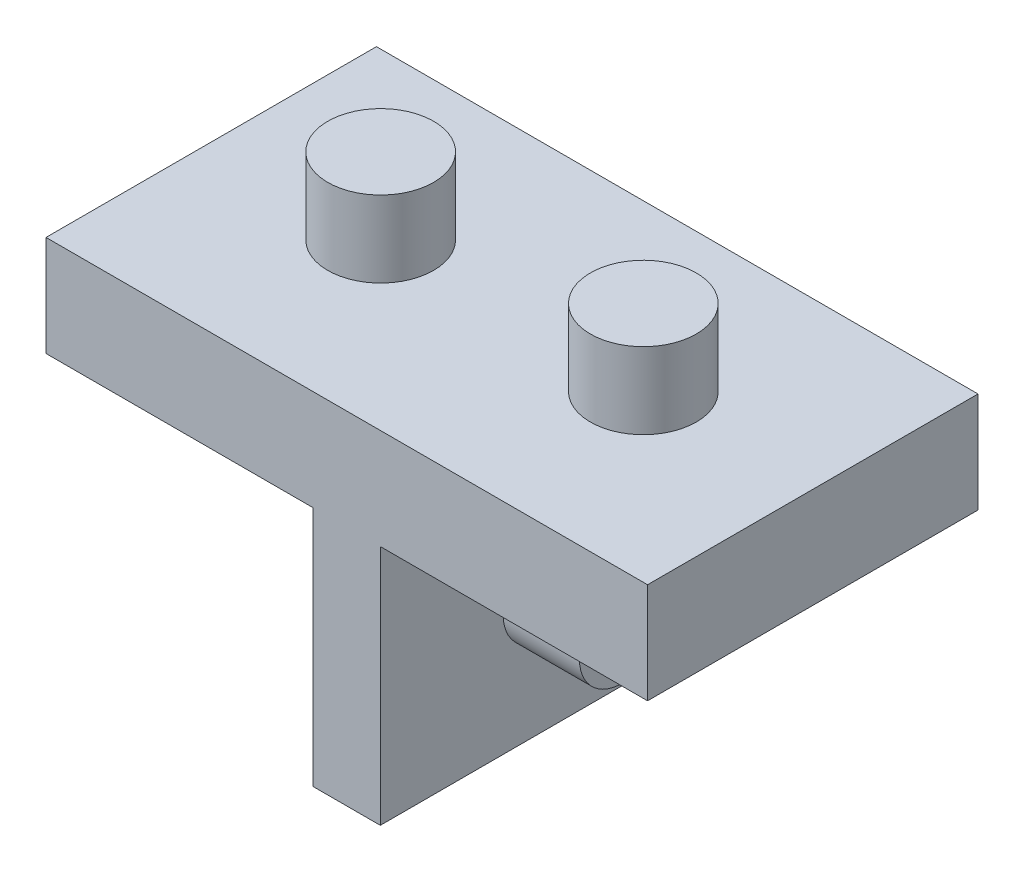
ISO-10303-21;
HEADER;
FILE_DESCRIPTION(('STEP AP214'),'2;1');
FILE_NAME('part.step','',(''),(''),'','','');
FILE_SCHEMA(('AUTOMOTIVE_DESIGN { 1 0 10303 214 1 1 1 1 }'));
ENDSEC;
DATA;
#1=APPLICATION_CONTEXT('core data for automotive mechanical design processes');
#2=APPLICATION_PROTOCOL_DEFINITION('international standard','automotive_design',2000,#1);
#3=PRODUCT_CONTEXT('',#1,'mechanical');
#4=PRODUCT('Part','Part','',(#3));
#5=PRODUCT_RELATED_PRODUCT_CATEGORY('part','',(#4));
#6=PRODUCT_DEFINITION_FORMATION('','',#4);
#7=PRODUCT_DEFINITION_CONTEXT('part definition',#1,'design');
#8=PRODUCT_DEFINITION('design','',#6,#7);
#9=PRODUCT_DEFINITION_SHAPE('','',#8);
#10=(LENGTH_UNIT() NAMED_UNIT(*) SI_UNIT(.MILLI.,.METRE.));
#11=(NAMED_UNIT(*) PLANE_ANGLE_UNIT() SI_UNIT($,.RADIAN.));
#12=(NAMED_UNIT(*) SI_UNIT($,.STERADIAN.) SOLID_ANGLE_UNIT());
#13=UNCERTAINTY_MEASURE_WITH_UNIT(LENGTH_MEASURE(1.E-05),#10,'distance_accuracy_value','');
#14=(GEOMETRIC_REPRESENTATION_CONTEXT(3) GLOBAL_UNCERTAINTY_ASSIGNED_CONTEXT((#13)) GLOBAL_UNIT_ASSIGNED_CONTEXT((#10,
#11,#12)) REPRESENTATION_CONTEXT('',''));
#15=CARTESIAN_POINT('',(0.,0.,0.));
#16=DIRECTION('',(0.,0.,1.));
#17=DIRECTION('',(1.,0.,0.));
#18=AXIS2_PLACEMENT_3D('',#15,#16,#17);
#19=CARTESIAN_POINT('',(21.3,7.12,11.7));
#20=DIRECTION('',(0.,-1.,0.));
#21=DIRECTION('',(1.,0.,0.));
#22=AXIS2_PLACEMENT_3D('',#19,#20,#21);
#23=PLANE('',#22);
#24=CARTESIAN_POINT('',(-9.3,7.12,0.));
#25=DIRECTION('',(0.,-1.,0.));
#26=DIRECTION('',(1.,0.,0.));
#27=AXIS2_PLACEMENT_3D('',#24,#25,#26);
#28=CIRCLE('',#27,3.75);
#29=CARTESIAN_POINT('',(-5.55,7.12,0.));
#30=VERTEX_POINT('',#29);
#31=EDGE_CURVE('E53',#30,#30,#28,.F.);
#32=ORIENTED_EDGE('',*,*,#31,.F.);
#33=EDGE_LOOP('',(#32));
#34=FACE_BOUND('',#33,.T.);
#35=CARTESIAN_POINT('',(9.3,7.12,0.));
#36=DIRECTION('',(0.,-1.,0.));
#37=DIRECTION('',(1.,0.,0.));
#38=AXIS2_PLACEMENT_3D('',#35,#36,#37);
#39=CIRCLE('',#38,3.75);
#40=CARTESIAN_POINT('',(13.05,7.12,0.));
#41=VERTEX_POINT('',#40);
#42=EDGE_CURVE('E191',#41,#41,#39,.F.);
#43=ORIENTED_EDGE('',*,*,#42,.F.);
#44=EDGE_LOOP('',(#43));
#45=FACE_BOUND('',#44,.T.);
#46=DIRECTION('',(-1.,0.,0.));
#47=VECTOR('',#46,1.);
#48=CARTESIAN_POINT('',(21.3,7.12,-11.7));
#49=LINE('',#48,#47);
#50=CARTESIAN_POINT('',(21.3,7.12,-11.7));
#51=VERTEX_POINT('',#50);
#52=CARTESIAN_POINT('',(-21.3,7.12,-11.7));
#53=VERTEX_POINT('',#52);
#54=EDGE_CURVE('E146',#51,#53,#49,.T.);
#55=ORIENTED_EDGE('',*,*,#54,.T.);
#56=DIRECTION('',(0.,0.,-1.));
#57=VECTOR('',#56,1.);
#58=CARTESIAN_POINT('',(-21.3,7.12,11.7));
#59=LINE('',#58,#57);
#60=CARTESIAN_POINT('',(-21.3,7.12,11.7));
#61=VERTEX_POINT('',#60);
#62=EDGE_CURVE('E188',#61,#53,#59,.T.);
#63=ORIENTED_EDGE('',*,*,#62,.F.);
#64=DIRECTION('',(-1.,0.,0.));
#65=VECTOR('',#64,1.);
#66=CARTESIAN_POINT('',(21.3,7.12,11.7));
#67=LINE('',#66,#65);
#68=CARTESIAN_POINT('',(21.3,7.12,11.7));
#69=VERTEX_POINT('',#68);
#70=EDGE_CURVE('E169',#69,#61,#67,.T.);
#71=ORIENTED_EDGE('',*,*,#70,.F.);
#72=DIRECTION('',(0.,0.,-1.));
#73=VECTOR('',#72,1.);
#74=CARTESIAN_POINT('',(21.3,7.12,11.7));
#75=LINE('',#74,#73);
#76=EDGE_CURVE('E142',#69,#51,#75,.T.);
#77=ORIENTED_EDGE('',*,*,#76,.T.);
#78=EDGE_LOOP('',(#55,#63,#71,#77));
#79=FACE_BOUND('',#78,.T.);
#80=ADVANCED_FACE('F44',(#34,#45,#79),#23,.F.);
#81=CARTESIAN_POINT('',(-21.3,7.12,11.7));
#82=DIRECTION('',(1.,0.,0.));
#83=DIRECTION('',(0.,0.,-1.));
#84=AXIS2_PLACEMENT_3D('',#81,#82,#83);
#85=PLANE('',#84);
#86=DIRECTION('',(0.,-1.,0.));
#87=VECTOR('',#86,1.);
#88=CARTESIAN_POINT('',(-21.3,7.12,-11.7));
#89=LINE('',#88,#87);
#90=CARTESIAN_POINT('',(-21.3,0.,-11.7));
#91=VERTEX_POINT('',#90);
#92=EDGE_CURVE('E150',#53,#91,#89,.T.);
#93=ORIENTED_EDGE('',*,*,#92,.T.);
#94=DIRECTION('',(0.,0.,-1.));
#95=VECTOR('',#94,1.);
#96=CARTESIAN_POINT('',(-21.3,0.,11.7));
#97=LINE('',#96,#95);
#98=CARTESIAN_POINT('',(-21.3,0.,11.7));
#99=VERTEX_POINT('',#98);
#100=EDGE_CURVE('E184',#99,#91,#97,.T.);
#101=ORIENTED_EDGE('',*,*,#100,.F.);
#102=DIRECTION('',(0.,-1.,0.));
#103=VECTOR('',#102,1.);
#104=CARTESIAN_POINT('',(-21.3,7.12,11.7));
#105=LINE('',#104,#103);
#106=EDGE_CURVE('E105',#61,#99,#105,.T.);
#107=ORIENTED_EDGE('',*,*,#106,.F.);
#108=ORIENTED_EDGE('',*,*,#62,.T.);
#109=EDGE_LOOP('',(#93,#101,#107,#108));
#110=FACE_BOUND('',#109,.T.);
#111=ADVANCED_FACE('F202',(#110),#85,.F.);
#112=CARTESIAN_POINT('',(-21.3,0.,11.7));
#113=DIRECTION('',(0.,1.,0.));
#114=DIRECTION('',(0.,0.,1.));
#115=AXIS2_PLACEMENT_3D('',#112,#113,#114);
#116=PLANE('',#115);
#117=DIRECTION('',(1.,0.,0.));
#118=VECTOR('',#117,1.);
#119=CARTESIAN_POINT('',(-21.3,0.,-11.7));
#120=LINE('',#119,#118);
#121=CARTESIAN_POINT('',(-2.375,0.,-11.7));
#122=VERTEX_POINT('',#121);
#123=EDGE_CURVE('E154',#91,#122,#120,.T.);
#124=ORIENTED_EDGE('',*,*,#123,.T.);
#125=DIRECTION('',(0.,0.,-1.));
#126=VECTOR('',#125,1.);
#127=CARTESIAN_POINT('',(-2.375,0.,11.7));
#128=LINE('',#127,#126);
#129=CARTESIAN_POINT('',(-2.375,0.,11.7));
#130=VERTEX_POINT('',#129);
#131=EDGE_CURVE('E180',#130,#122,#128,.T.);
#132=ORIENTED_EDGE('',*,*,#131,.F.);
#133=DIRECTION('',(1.,0.,0.));
#134=VECTOR('',#133,1.);
#135=CARTESIAN_POINT('',(-21.3,0.,11.7));
#136=LINE('',#135,#134);
#137=EDGE_CURVE('E297',#99,#130,#136,.T.);
#138=ORIENTED_EDGE('',*,*,#137,.F.);
#139=ORIENTED_EDGE('',*,*,#100,.T.);
#140=EDGE_LOOP('',(#124,#132,#138,#139));
#141=FACE_BOUND('',#140,.T.);
#142=ADVANCED_FACE('F213',(#141),#116,.F.);
#143=CARTESIAN_POINT('',(-2.375,0.,11.7));
#144=DIRECTION('',(1.,0.,0.));
#145=DIRECTION('',(0.,1.,0.));
#146=AXIS2_PLACEMENT_3D('',#143,#144,#145);
#147=PLANE('',#146);
#148=CARTESIAN_POINT('',(-2.375,-8.55,0.));
#149=DIRECTION('',(1.,0.,0.));
#150=DIRECTION('',(0.,0.,-1.));
#151=AXIS2_PLACEMENT_3D('',#148,#149,#150);
#152=CIRCLE('',#151,3.);
#153=CARTESIAN_POINT('',(-2.375,-8.55,-3.));
#154=VERTEX_POINT('',#153);
#155=EDGE_CURVE('E277',#154,#154,#152,.T.);
#156=ORIENTED_EDGE('',*,*,#155,.T.);
#157=EDGE_LOOP('',(#156));
#158=FACE_BOUND('',#157,.T.);
#159=DIRECTION('',(0.,-1.,0.));
#160=VECTOR('',#159,1.);
#161=CARTESIAN_POINT('',(-2.375,0.,-11.7));
#162=LINE('',#161,#160);
#163=CARTESIAN_POINT('',(-2.375,-17.1,-11.7));
#164=VERTEX_POINT('',#163);
#165=EDGE_CURVE('E157',#122,#164,#162,.T.);
#166=ORIENTED_EDGE('',*,*,#165,.T.);
#167=DIRECTION('',(0.,0.,-1.));
#168=VECTOR('',#167,1.);
#169=CARTESIAN_POINT('',(-2.375,-17.1,11.7));
#170=LINE('',#169,#168);
#171=CARTESIAN_POINT('',(-2.375,-17.1,11.7));
#172=VERTEX_POINT('',#171);
#173=EDGE_CURVE('E176',#172,#164,#170,.T.);
#174=ORIENTED_EDGE('',*,*,#173,.F.);
#175=DIRECTION('',(0.,-1.,0.));
#176=VECTOR('',#175,1.);
#177=CARTESIAN_POINT('',(-2.375,0.,11.7));
#178=LINE('',#177,#176);
#179=EDGE_CURVE('E300',#130,#172,#178,.T.);
#180=ORIENTED_EDGE('',*,*,#179,.F.);
#181=ORIENTED_EDGE('',*,*,#131,.T.);
#182=EDGE_LOOP('',(#166,#174,#180,#181));
#183=FACE_BOUND('',#182,.T.);
#184=ADVANCED_FACE('F217',(#158,#183),#147,.F.);
#185=CARTESIAN_POINT('',(-2.375,-17.1,11.7));
#186=DIRECTION('',(0.,1.,0.));
#187=DIRECTION('',(0.,0.,1.));
#188=AXIS2_PLACEMENT_3D('',#185,#186,#187);
#189=PLANE('',#188);
#190=DIRECTION('',(1.,0.,0.));
#191=VECTOR('',#190,1.);
#192=CARTESIAN_POINT('',(-2.375,-17.1,-11.7));
#193=LINE('',#192,#191);
#194=CARTESIAN_POINT('',(2.375,-17.1,-11.7));
#195=VERTEX_POINT('',#194);
#196=EDGE_CURVE('E160',#164,#195,#193,.T.);
#197=ORIENTED_EDGE('',*,*,#196,.T.);
#198=DIRECTION('',(0.,0.,-1.));
#199=VECTOR('',#198,1.);
#200=CARTESIAN_POINT('',(2.375,-17.1,11.7));
#201=LINE('',#200,#199);
#202=CARTESIAN_POINT('',(2.375,-17.1,11.7));
#203=VERTEX_POINT('',#202);
#204=EDGE_CURVE('E135',#203,#195,#201,.T.);
#205=ORIENTED_EDGE('',*,*,#204,.F.);
#206=DIRECTION('',(1.,0.,0.));
#207=VECTOR('',#206,1.);
#208=CARTESIAN_POINT('',(-2.375,-17.1,11.7));
#209=LINE('',#208,#207);
#210=EDGE_CURVE('E124',#172,#203,#209,.T.);
#211=ORIENTED_EDGE('',*,*,#210,.F.);
#212=ORIENTED_EDGE('',*,*,#173,.T.);
#213=EDGE_LOOP('',(#197,#205,#211,#212));
#214=FACE_BOUND('',#213,.T.);
#215=ADVANCED_FACE('F223',(#214),#189,.F.);
#216=CARTESIAN_POINT('',(2.375,-17.1,11.7));
#217=DIRECTION('',(-1.,0.,0.));
#218=DIRECTION('',(0.,-1.,0.));
#219=AXIS2_PLACEMENT_3D('',#216,#217,#218);
#220=PLANE('',#219);
#221=CARTESIAN_POINT('',(2.375,-8.55,0.));
#222=DIRECTION('',(-1.,0.,0.));
#223=DIRECTION('',(0.,-1.,0.));
#224=AXIS2_PLACEMENT_3D('',#221,#222,#223);
#225=CIRCLE('',#224,3.);
#226=CARTESIAN_POINT('',(2.375,-8.55,3.));
#227=VERTEX_POINT('',#226);
#228=EDGE_CURVE('E11',#227,#227,#225,.F.);
#229=ORIENTED_EDGE('',*,*,#228,.F.);
#230=EDGE_LOOP('',(#229));
#231=FACE_BOUND('',#230,.T.);
#232=DIRECTION('',(0.,1.,0.));
#233=VECTOR('',#232,1.);
#234=CARTESIAN_POINT('',(2.375,-17.1,-11.7));
#235=LINE('',#234,#233);
#236=CARTESIAN_POINT('',(2.375,0.,-11.7));
#237=VERTEX_POINT('',#236);
#238=EDGE_CURVE('E133',#195,#237,#235,.T.);
#239=ORIENTED_EDGE('',*,*,#238,.T.);
#240=DIRECTION('',(0.,0.,-1.));
#241=VECTOR('',#240,1.);
#242=CARTESIAN_POINT('',(2.375,0.,11.7));
#243=LINE('',#242,#241);
#244=CARTESIAN_POINT('',(2.375,0.,11.7));
#245=VERTEX_POINT('',#244);
#246=EDGE_CURVE('E130',#245,#237,#243,.T.);
#247=ORIENTED_EDGE('',*,*,#246,.F.);
#248=DIRECTION('',(0.,1.,0.));
#249=VECTOR('',#248,1.);
#250=CARTESIAN_POINT('',(2.375,-17.1,11.7));
#251=LINE('',#250,#249);
#252=EDGE_CURVE('E118',#203,#245,#251,.T.);
#253=ORIENTED_EDGE('',*,*,#252,.F.);
#254=ORIENTED_EDGE('',*,*,#204,.T.);
#255=EDGE_LOOP('',(#239,#247,#253,#254));
#256=FACE_BOUND('',#255,.T.);
#257=ADVANCED_FACE('F131',(#231,#256),#220,.F.);
#258=CARTESIAN_POINT('',(2.375,0.,11.7));
#259=DIRECTION('',(0.,1.,0.));
#260=DIRECTION('',(-1.,0.,0.));
#261=AXIS2_PLACEMENT_3D('',#258,#259,#260);
#262=PLANE('',#261);
#263=DIRECTION('',(1.,0.,0.));
#264=VECTOR('',#263,1.);
#265=CARTESIAN_POINT('',(2.375,0.,-11.7));
#266=LINE('',#265,#264);
#267=CARTESIAN_POINT('',(21.3,0.,-11.7));
#268=VERTEX_POINT('',#267);
#269=EDGE_CURVE('E90',#237,#268,#266,.T.);
#270=ORIENTED_EDGE('',*,*,#269,.T.);
#271=DIRECTION('',(0.,0.,-1.));
#272=VECTOR('',#271,1.);
#273=CARTESIAN_POINT('',(21.3,0.,11.7));
#274=LINE('',#273,#272);
#275=CARTESIAN_POINT('',(21.3,0.,11.7));
#276=VERTEX_POINT('',#275);
#277=EDGE_CURVE('E136',#276,#268,#274,.T.);
#278=ORIENTED_EDGE('',*,*,#277,.F.);
#279=DIRECTION('',(1.,0.,0.));
#280=VECTOR('',#279,1.);
#281=CARTESIAN_POINT('',(2.375,0.,11.7));
#282=LINE('',#281,#280);
#283=EDGE_CURVE('E122',#245,#276,#282,.T.);
#284=ORIENTED_EDGE('',*,*,#283,.F.);
#285=ORIENTED_EDGE('',*,*,#246,.T.);
#286=EDGE_LOOP('',(#270,#278,#284,#285));
#287=FACE_BOUND('',#286,.T.);
#288=ADVANCED_FACE('F138',(#287),#262,.F.);
#289=CARTESIAN_POINT('',(21.3,0.,11.7));
#290=DIRECTION('',(-1.,0.,0.));
#291=DIRECTION('',(0.,0.,1.));
#292=AXIS2_PLACEMENT_3D('',#289,#290,#291);
#293=PLANE('',#292);
#294=DIRECTION('',(0.,1.,0.));
#295=VECTOR('',#294,1.);
#296=CARTESIAN_POINT('',(21.3,0.,-11.7));
#297=LINE('',#296,#295);
#298=EDGE_CURVE('E96',#268,#51,#297,.T.);
#299=ORIENTED_EDGE('',*,*,#298,.T.);
#300=ORIENTED_EDGE('',*,*,#76,.F.);
#301=DIRECTION('',(0.,1.,0.));
#302=VECTOR('',#301,1.);
#303=CARTESIAN_POINT('',(21.3,0.,11.7));
#304=LINE('',#303,#302);
#305=EDGE_CURVE('E61',#276,#69,#304,.T.);
#306=ORIENTED_EDGE('',*,*,#305,.F.);
#307=ORIENTED_EDGE('',*,*,#277,.T.);
#308=EDGE_LOOP('',(#299,#300,#306,#307));
#309=FACE_BOUND('',#308,.T.);
#310=ADVANCED_FACE('F233',(#309),#293,.F.);
#311=CARTESIAN_POINT('',(0.,0.,11.7));
#312=DIRECTION('',(0.,0.,1.));
#313=DIRECTION('',(1.,0.,0.));
#314=AXIS2_PLACEMENT_3D('',#311,#312,#313);
#315=PLANE('',#314);
#316=ORIENTED_EDGE('',*,*,#70,.T.);
#317=ORIENTED_EDGE('',*,*,#106,.T.);
#318=ORIENTED_EDGE('',*,*,#137,.T.);
#319=ORIENTED_EDGE('',*,*,#179,.T.);
#320=ORIENTED_EDGE('',*,*,#210,.T.);
#321=ORIENTED_EDGE('',*,*,#252,.T.);
#322=ORIENTED_EDGE('',*,*,#283,.T.);
#323=ORIENTED_EDGE('',*,*,#305,.T.);
#324=EDGE_LOOP('',(#316,#317,#318,#319,#320,#321,#322,#323));
#325=FACE_BOUND('',#324,.T.);
#326=ADVANCED_FACE('F120',(#325),#315,.T.);
#327=CARTESIAN_POINT('',(0.,0.,-11.7));
#328=DIRECTION('',(0.,0.,1.));
#329=DIRECTION('',(1.,0.,0.));
#330=AXIS2_PLACEMENT_3D('',#327,#328,#329);
#331=PLANE('',#330);
#332=ORIENTED_EDGE('',*,*,#54,.F.);
#333=ORIENTED_EDGE('',*,*,#298,.F.);
#334=ORIENTED_EDGE('',*,*,#269,.F.);
#335=ORIENTED_EDGE('',*,*,#238,.F.);
#336=ORIENTED_EDGE('',*,*,#196,.F.);
#337=ORIENTED_EDGE('',*,*,#165,.F.);
#338=ORIENTED_EDGE('',*,*,#123,.F.);
#339=ORIENTED_EDGE('',*,*,#92,.F.);
#340=EDGE_LOOP('',(#332,#333,#334,#335,#336,#337,#338,#339));
#341=FACE_BOUND('',#340,.T.);
#342=ADVANCED_FACE('F209',(#341),#331,.F.);
#343=CARTESIAN_POINT('',(9.3,12.52,0.));
#344=DIRECTION('',(0.,-1.,0.));
#345=DIRECTION('',(1.,0.,0.));
#346=AXIS2_PLACEMENT_3D('',#343,#344,#345);
#347=CYLINDRICAL_SURFACE('',#346,3.75);
#348=CARTESIAN_POINT('',(9.3,12.52,0.));
#349=DIRECTION('',(0.,1.,0.));
#350=DIRECTION('',(-1.,0.,0.));
#351=AXIS2_PLACEMENT_3D('',#348,#349,#350);
#352=CIRCLE('',#351,3.75);
#353=CARTESIAN_POINT('',(13.05,12.52,0.));
#354=VERTEX_POINT('',#353);
#355=EDGE_CURVE('E282',#354,#354,#352,.T.);
#356=CARTESIAN_POINT('',(13.05,12.52,0.));
#357=CARTESIAN_POINT('',(13.05,12.46375,0.));
#358=CARTESIAN_POINT('',(13.05,12.4075,0.));
#359=CARTESIAN_POINT('',(13.05,12.295,0.));
#360=CARTESIAN_POINT('',(13.05,12.23875,0.));
#361=CARTESIAN_POINT('',(13.05,12.12625,0.));
#362=CARTESIAN_POINT('',(13.05,12.07,0.));
#363=CARTESIAN_POINT('',(13.05,11.9575,0.));
#364=CARTESIAN_POINT('',(13.05,11.90125,0.));
#365=CARTESIAN_POINT('',(13.05,11.78875,0.));
#366=CARTESIAN_POINT('',(13.05,11.7325,0.));
#367=CARTESIAN_POINT('',(13.05,11.62,0.));
#368=CARTESIAN_POINT('',(13.05,11.56375,0.));
#369=CARTESIAN_POINT('',(13.05,11.45125,0.));
#370=CARTESIAN_POINT('',(13.05,11.395,0.));
#371=CARTESIAN_POINT('',(13.05,11.2825,0.));
#372=CARTESIAN_POINT('',(13.05,11.22625,0.));
#373=CARTESIAN_POINT('',(13.05,11.11375,0.));
#374=CARTESIAN_POINT('',(13.05,11.0575,0.));
#375=CARTESIAN_POINT('',(13.05,10.945,0.));
#376=CARTESIAN_POINT('',(13.05,10.88875,0.));
#377=CARTESIAN_POINT('',(13.05,10.77625,0.));
#378=CARTESIAN_POINT('',(13.05,10.72,0.));
#379=CARTESIAN_POINT('',(13.05,10.6075,0.));
#380=CARTESIAN_POINT('',(13.05,10.55125,0.));
#381=CARTESIAN_POINT('',(13.05,10.43875,0.));
#382=CARTESIAN_POINT('',(13.05,10.3825,0.));
#383=CARTESIAN_POINT('',(13.05,10.27,0.));
#384=CARTESIAN_POINT('',(13.05,10.21375,0.));
#385=CARTESIAN_POINT('',(13.05,10.10125,0.));
#386=CARTESIAN_POINT('',(13.05,10.045,0.));
#387=CARTESIAN_POINT('',(13.05,9.9325,0.));
#388=CARTESIAN_POINT('',(13.05,9.87625,0.));
#389=CARTESIAN_POINT('',(13.05,9.76375,0.));
#390=CARTESIAN_POINT('',(13.05,9.7075,0.));
#391=CARTESIAN_POINT('',(13.05,9.595,0.));
#392=CARTESIAN_POINT('',(13.05,9.53875,0.));
#393=CARTESIAN_POINT('',(13.05,9.42625,0.));
#394=CARTESIAN_POINT('',(13.05,9.37,0.));
#395=CARTESIAN_POINT('',(13.05,9.2575,0.));
#396=CARTESIAN_POINT('',(13.05,9.20125000000001,0.));
#397=CARTESIAN_POINT('',(13.05,9.08875,0.));
#398=CARTESIAN_POINT('',(13.05,9.0325,0.));
#399=CARTESIAN_POINT('',(13.05,8.92,0.));
#400=CARTESIAN_POINT('',(13.05,8.86375,0.));
#401=CARTESIAN_POINT('',(13.05,8.75125,0.));
#402=CARTESIAN_POINT('',(13.05,8.695,0.));
#403=CARTESIAN_POINT('',(13.05,8.5825,0.));
#404=CARTESIAN_POINT('',(13.05,8.52625,0.));
#405=CARTESIAN_POINT('',(13.05,8.41375,0.));
#406=CARTESIAN_POINT('',(13.05,8.3575,0.));
#407=CARTESIAN_POINT('',(13.05,8.245,0.));
#408=CARTESIAN_POINT('',(13.05,8.18875,0.));
#409=CARTESIAN_POINT('',(13.05,8.07625,0.));
#410=CARTESIAN_POINT('',(13.05,8.02,0.));
#411=CARTESIAN_POINT('',(13.05,7.9075,0.));
#412=CARTESIAN_POINT('',(13.05,7.85125,0.));
#413=CARTESIAN_POINT('',(13.05,7.73875,0.));
#414=CARTESIAN_POINT('',(13.05,7.6825,0.));
#415=CARTESIAN_POINT('',(13.05,7.57,0.));
#416=CARTESIAN_POINT('',(13.05,7.51375,0.));
#417=CARTESIAN_POINT('',(13.05,7.40125,0.));
#418=CARTESIAN_POINT('',(13.05,7.345,0.));
#419=CARTESIAN_POINT('',(13.05,7.2325,0.));
#420=CARTESIAN_POINT('',(13.05,7.17625,0.));
#421=CARTESIAN_POINT('',(13.05,7.12,0.));
#422=B_SPLINE_CURVE_WITH_KNOTS('',3,(#356,#357,#358,#359,#360,#361,#362,#363,#364,#365,#366,
#367,#368,#369,#370,#371,#372,#373,#374,#375,#376,#377,#378,#379,#380,#381,#382,#383,#384,#385,
#386,#387,#388,#389,#390,#391,#392,#393,#394,#395,#396,#397,#398,#399,#400,#401,#402,#403,#404,
#405,#406,#407,#408,#409,#410,#411,#412,#413,#414,#415,#416,#417,#418,#419,#420,#421),
.UNSPECIFIED.,.F.,.F.,(4,2,2,2,2,2,2,2,2,2,2,2,2,2,2,2,2,2,2,2,2,2,2,2,2,2,2,2,2,2,2,2,4),(0.,
0.168750000000001,0.337500000000001,0.506250000000002,0.675,0.843750000000001,1.0125,1.18125,
1.35,1.51875,1.6875,1.85625,2.025,2.19375,2.3625,2.53125,2.7,2.86875,3.0375,3.20625,3.375,
3.54375,3.7125,3.88125,4.05,4.21875,4.3875,4.55625,4.725,4.89375,5.0625,5.23125,5.4),.UNSPECIFIED.);
#423=EDGE_CURVE('BSEAM238',#354,#41,#422,.T.);
#424=ORIENTED_EDGE('',*,*,#355,.F.);
#425=ORIENTED_EDGE('',*,*,#42,.T.);
#426=ORIENTED_EDGE('',*,*,#423,.T.);
#427=ORIENTED_EDGE('',*,*,#423,.F.);
#428=EDGE_LOOP('',(#424,#426,#425,#427));
#429=FACE_BOUND('',#428,.T.);
#430=ADVANCED_FACE('F238',(#429),#347,.T.);
#431=CARTESIAN_POINT('',(9.3,12.52,0.));
#432=DIRECTION('',(0.,1.,0.));
#433=DIRECTION('',(-1.,0.,0.));
#434=AXIS2_PLACEMENT_3D('',#431,#432,#433);
#435=PLANE('',#434);
#436=ORIENTED_EDGE('',*,*,#355,.T.);
#437=EDGE_LOOP('',(#436));
#438=FACE_BOUND('',#437,.T.);
#439=ADVANCED_FACE('F241',(#438),#435,.T.);
#440=CARTESIAN_POINT('',(-9.3,12.52,0.));
#441=DIRECTION('',(0.,-1.,0.));
#442=DIRECTION('',(1.,0.,0.));
#443=AXIS2_PLACEMENT_3D('',#440,#441,#442);
#444=CYLINDRICAL_SURFACE('',#443,3.75);
#445=CARTESIAN_POINT('',(-9.3,12.52,0.));
#446=DIRECTION('',(0.,1.,0.));
#447=DIRECTION('',(-1.,0.,0.));
#448=AXIS2_PLACEMENT_3D('',#445,#446,#447);
#449=CIRCLE('',#448,3.75);
#450=CARTESIAN_POINT('',(-5.55,12.52,0.));
#451=VERTEX_POINT('',#450);
#452=EDGE_CURVE('E151',#451,#451,#449,.T.);
#453=CARTESIAN_POINT('',(-5.55,12.52,0.));
#454=CARTESIAN_POINT('',(-5.55,12.46375,0.));
#455=CARTESIAN_POINT('',(-5.55,12.4075,0.));
#456=CARTESIAN_POINT('',(-5.55,12.295,0.));
#457=CARTESIAN_POINT('',(-5.55,12.23875,0.));
#458=CARTESIAN_POINT('',(-5.55,12.12625,0.));
#459=CARTESIAN_POINT('',(-5.55,12.07,0.));
#460=CARTESIAN_POINT('',(-5.55,11.9575,0.));
#461=CARTESIAN_POINT('',(-5.55,11.90125,0.));
#462=CARTESIAN_POINT('',(-5.55,11.78875,0.));
#463=CARTESIAN_POINT('',(-5.55,11.7325,0.));
#464=CARTESIAN_POINT('',(-5.55,11.62,0.));
#465=CARTESIAN_POINT('',(-5.55,11.56375,0.));
#466=CARTESIAN_POINT('',(-5.55,11.45125,0.));
#467=CARTESIAN_POINT('',(-5.55,11.395,0.));
#468=CARTESIAN_POINT('',(-5.55,11.2825,0.));
#469=CARTESIAN_POINT('',(-5.55,11.22625,0.));
#470=CARTESIAN_POINT('',(-5.55,11.11375,0.));
#471=CARTESIAN_POINT('',(-5.55,11.0575,0.));
#472=CARTESIAN_POINT('',(-5.55,10.945,0.));
#473=CARTESIAN_POINT('',(-5.55,10.88875,0.));
#474=CARTESIAN_POINT('',(-5.55,10.77625,0.));
#475=CARTESIAN_POINT('',(-5.55,10.72,0.));
#476=CARTESIAN_POINT('',(-5.55,10.6075,0.));
#477=CARTESIAN_POINT('',(-5.55,10.55125,0.));
#478=CARTESIAN_POINT('',(-5.55,10.43875,0.));
#479=CARTESIAN_POINT('',(-5.55,10.3825,0.));
#480=CARTESIAN_POINT('',(-5.55,10.27,0.));
#481=CARTESIAN_POINT('',(-5.55,10.21375,0.));
#482=CARTESIAN_POINT('',(-5.55,10.10125,0.));
#483=CARTESIAN_POINT('',(-5.55,10.045,0.));
#484=CARTESIAN_POINT('',(-5.55,9.9325,0.));
#485=CARTESIAN_POINT('',(-5.55,9.87625,0.));
#486=CARTESIAN_POINT('',(-5.55,9.76375,0.));
#487=CARTESIAN_POINT('',(-5.55,9.7075,0.));
#488=CARTESIAN_POINT('',(-5.55,9.595,0.));
#489=CARTESIAN_POINT('',(-5.55,9.53875,0.));
#490=CARTESIAN_POINT('',(-5.55,9.42625,0.));
#491=CARTESIAN_POINT('',(-5.55,9.37,0.));
#492=CARTESIAN_POINT('',(-5.55,9.2575,0.));
#493=CARTESIAN_POINT('',(-5.55,9.20125,0.));
#494=CARTESIAN_POINT('',(-5.55,9.08875,0.));
#495=CARTESIAN_POINT('',(-5.55,9.0325,0.));
#496=CARTESIAN_POINT('',(-5.55,8.92,0.));
#497=CARTESIAN_POINT('',(-5.55,8.86375,0.));
#498=CARTESIAN_POINT('',(-5.55,8.75125,0.));
#499=CARTESIAN_POINT('',(-5.55,8.695,0.));
#500=CARTESIAN_POINT('',(-5.55,8.5825,0.));
#501=CARTESIAN_POINT('',(-5.55,8.52625,0.));
#502=CARTESIAN_POINT('',(-5.55,8.41375,0.));
#503=CARTESIAN_POINT('',(-5.55,8.3575,0.));
#504=CARTESIAN_POINT('',(-5.55,8.245,0.));
#505=CARTESIAN_POINT('',(-5.55,8.18875,0.));
#506=CARTESIAN_POINT('',(-5.55,8.07625,0.));
#507=CARTESIAN_POINT('',(-5.55,8.02,0.));
#508=CARTESIAN_POINT('',(-5.55,7.9075,0.));
#509=CARTESIAN_POINT('',(-5.55,7.85125,0.));
#510=CARTESIAN_POINT('',(-5.55,7.73875,0.));
#511=CARTESIAN_POINT('',(-5.55,7.6825,0.));
#512=CARTESIAN_POINT('',(-5.55,7.57,0.));
#513=CARTESIAN_POINT('',(-5.55,7.51375,0.));
#514=CARTESIAN_POINT('',(-5.55,7.40125,0.));
#515=CARTESIAN_POINT('',(-5.55,7.345,0.));
#516=CARTESIAN_POINT('',(-5.55,7.2325,0.));
#517=CARTESIAN_POINT('',(-5.55,7.17625,0.));
#518=CARTESIAN_POINT('',(-5.55,7.12,0.));
#519=B_SPLINE_CURVE_WITH_KNOTS('',3,(#453,#454,#455,#456,#457,#458,#459,#460,#461,#462,#463,
#464,#465,#466,#467,#468,#469,#470,#471,#472,#473,#474,#475,#476,#477,#478,#479,#480,#481,#482,
#483,#484,#485,#486,#487,#488,#489,#490,#491,#492,#493,#494,#495,#496,#497,#498,#499,#500,#501,
#502,#503,#504,#505,#506,#507,#508,#509,#510,#511,#512,#513,#514,#515,#516,#517,#518),
.UNSPECIFIED.,.F.,.F.,(4,2,2,2,2,2,2,2,2,2,2,2,2,2,2,2,2,2,2,2,2,2,2,2,2,2,2,2,2,2,2,2,4),(0.,
0.168750000000001,0.337500000000001,0.506250000000002,0.675,0.843750000000001,1.0125,1.18125,
1.35,1.51875,1.6875,1.85625,2.025,2.19375,2.3625,2.53125,2.7,2.86875,3.0375,3.20625,3.375,
3.54375,3.7125,3.88125,4.05,4.21875,4.3875,4.55625,4.725,4.89375,5.0625,5.23125,5.4),.UNSPECIFIED.);
#520=EDGE_CURVE('BSEAM198',#451,#30,#519,.T.);
#521=ORIENTED_EDGE('',*,*,#452,.F.);
#522=ORIENTED_EDGE('',*,*,#31,.T.);
#523=ORIENTED_EDGE('',*,*,#520,.T.);
#524=ORIENTED_EDGE('',*,*,#520,.F.);
#525=EDGE_LOOP('',(#521,#523,#522,#524));
#526=FACE_BOUND('',#525,.T.);
#527=ADVANCED_FACE('F198',(#526),#444,.T.);
#528=CARTESIAN_POINT('',(-9.3,12.52,0.));
#529=DIRECTION('',(0.,1.,0.));
#530=DIRECTION('',(-1.,0.,0.));
#531=AXIS2_PLACEMENT_3D('',#528,#529,#530);
#532=PLANE('',#531);
#533=ORIENTED_EDGE('',*,*,#452,.T.);
#534=EDGE_LOOP('',(#533));
#535=FACE_BOUND('',#534,.T.);
#536=ADVANCED_FACE('F250',(#535),#532,.T.);
#537=CARTESIAN_POINT('',(7.775,-8.55,0.));
#538=DIRECTION('',(-1.,0.,0.));
#539=DIRECTION('',(0.,0.,1.));
#540=AXIS2_PLACEMENT_3D('',#537,#538,#539);
#541=CYLINDRICAL_SURFACE('',#540,3.);
#542=CARTESIAN_POINT('',(7.775,-8.55,0.));
#543=DIRECTION('',(1.,0.,0.));
#544=DIRECTION('',(0.,0.,-1.));
#545=AXIS2_PLACEMENT_3D('',#542,#543,#544);
#546=CIRCLE('',#545,3.);
#547=CARTESIAN_POINT('',(7.775,-8.55,3.));
#548=VERTEX_POINT('',#547);
#549=EDGE_CURVE('E276',#548,#548,#546,.T.);
#550=CARTESIAN_POINT('',(7.775,-8.55,3.));
#551=CARTESIAN_POINT('',(7.71875,-8.55,3.));
#552=CARTESIAN_POINT('',(7.6625,-8.55,3.));
#553=CARTESIAN_POINT('',(7.55,-8.55,3.));
#554=CARTESIAN_POINT('',(7.49375,-8.55,3.));
#555=CARTESIAN_POINT('',(7.38125,-8.55,3.));
#556=CARTESIAN_POINT('',(7.325,-8.55,3.));
#557=CARTESIAN_POINT('',(7.2125,-8.55,3.));
#558=CARTESIAN_POINT('',(7.15625,-8.55,3.));
#559=CARTESIAN_POINT('',(7.04375,-8.55,3.));
#560=CARTESIAN_POINT('',(6.9875,-8.55,3.));
#561=CARTESIAN_POINT('',(6.875,-8.55,3.));
#562=CARTESIAN_POINT('',(6.81875,-8.55,3.));
#563=CARTESIAN_POINT('',(6.70625,-8.55,3.));
#564=CARTESIAN_POINT('',(6.65,-8.55,3.));
#565=CARTESIAN_POINT('',(6.5375,-8.55,3.));
#566=CARTESIAN_POINT('',(6.48125,-8.55,3.));
#567=CARTESIAN_POINT('',(6.36875,-8.55,3.));
#568=CARTESIAN_POINT('',(6.3125,-8.55,3.));
#569=CARTESIAN_POINT('',(6.2,-8.55,3.));
#570=CARTESIAN_POINT('',(6.14375,-8.55,3.));
#571=CARTESIAN_POINT('',(6.03125,-8.55,3.));
#572=CARTESIAN_POINT('',(5.975,-8.55,3.));
#573=CARTESIAN_POINT('',(5.8625,-8.55,3.));
#574=CARTESIAN_POINT('',(5.80625,-8.55,3.));
#575=CARTESIAN_POINT('',(5.69375,-8.55,3.));
#576=CARTESIAN_POINT('',(5.6375,-8.55,3.));
#577=CARTESIAN_POINT('',(5.525,-8.55,3.));
#578=CARTESIAN_POINT('',(5.46875,-8.55,3.));
#579=CARTESIAN_POINT('',(5.35625,-8.55,3.));
#580=CARTESIAN_POINT('',(5.3,-8.55,3.));
#581=CARTESIAN_POINT('',(5.1875,-8.55,3.));
#582=CARTESIAN_POINT('',(5.13125,-8.55,3.));
#583=CARTESIAN_POINT('',(5.01875,-8.55,3.));
#584=CARTESIAN_POINT('',(4.9625,-8.55,3.));
#585=CARTESIAN_POINT('',(4.85,-8.55,3.));
#586=CARTESIAN_POINT('',(4.79375,-8.55,3.));
#587=CARTESIAN_POINT('',(4.68125,-8.55,3.));
#588=CARTESIAN_POINT('',(4.625,-8.55,3.));
#589=CARTESIAN_POINT('',(4.5125,-8.55,3.));
#590=CARTESIAN_POINT('',(4.45625,-8.55,3.));
#591=CARTESIAN_POINT('',(4.34375,-8.55,3.));
#592=CARTESIAN_POINT('',(4.2875,-8.55,3.));
#593=CARTESIAN_POINT('',(4.175,-8.55,3.));
#594=CARTESIAN_POINT('',(4.11875,-8.55,3.));
#595=CARTESIAN_POINT('',(4.00625,-8.55,3.));
#596=CARTESIAN_POINT('',(3.95,-8.55,3.));
#597=CARTESIAN_POINT('',(3.8375,-8.55,3.));
#598=CARTESIAN_POINT('',(3.78125,-8.55,3.));
#599=CARTESIAN_POINT('',(3.66875,-8.55,3.));
#600=CARTESIAN_POINT('',(3.6125,-8.55,3.));
#601=CARTESIAN_POINT('',(3.5,-8.55,3.));
#602=CARTESIAN_POINT('',(3.44375,-8.55,3.));
#603=CARTESIAN_POINT('',(3.33125,-8.55,3.));
#604=CARTESIAN_POINT('',(3.275,-8.55,3.));
#605=CARTESIAN_POINT('',(3.1625,-8.55,3.));
#606=CARTESIAN_POINT('',(3.10625,-8.55,3.));
#607=CARTESIAN_POINT('',(2.99375,-8.55,3.));
#608=CARTESIAN_POINT('',(2.9375,-8.55,3.));
#609=CARTESIAN_POINT('',(2.825,-8.55,3.));
#610=CARTESIAN_POINT('',(2.76875,-8.55,3.));
#611=CARTESIAN_POINT('',(2.65625,-8.55,3.));
#612=CARTESIAN_POINT('',(2.6,-8.55,3.));
#613=CARTESIAN_POINT('',(2.4875,-8.55,3.));
#614=CARTESIAN_POINT('',(2.43125,-8.55,3.));
#615=CARTESIAN_POINT('',(2.375,-8.55,3.));
#616=B_SPLINE_CURVE_WITH_KNOTS('',3,(#550,#551,#552,#553,#554,#555,#556,#557,#558,#559,#560,
#561,#562,#563,#564,#565,#566,#567,#568,#569,#570,#571,#572,#573,#574,#575,#576,#577,#578,#579,
#580,#581,#582,#583,#584,#585,#586,#587,#588,#589,#590,#591,#592,#593,#594,#595,#596,#597,#598,
#599,#600,#601,#602,#603,#604,#605,#606,#607,#608,#609,#610,#611,#612,#613,#614,#615),
.UNSPECIFIED.,.F.,.F.,(4,2,2,2,2,2,2,2,2,2,2,2,2,2,2,2,2,2,2,2,2,2,2,2,2,2,2,2,2,2,2,2,4),(0.,
0.168750000000001,0.3375,0.506250000000001,0.675,0.843750000000001,1.0125,1.18125,1.35,1.51875,
1.6875,1.85625,2.025,2.19375,2.3625,2.53125,2.7,2.86875,3.0375,3.20625,3.375,3.54375,3.7125,
3.88125,4.05,4.21875,4.3875,4.55625,4.725,4.89375,5.0625,5.23125,5.4),.UNSPECIFIED.);
#617=EDGE_CURVE('BSEAM254',#548,#227,#616,.T.);
#618=ORIENTED_EDGE('',*,*,#549,.F.);
#619=ORIENTED_EDGE('',*,*,#228,.T.);
#620=ORIENTED_EDGE('',*,*,#617,.T.);
#621=ORIENTED_EDGE('',*,*,#617,.F.);
#622=EDGE_LOOP('',(#618,#620,#619,#621));
#623=FACE_BOUND('',#622,.T.);
#624=ADVANCED_FACE('F254',(#623),#541,.T.);
#625=CARTESIAN_POINT('',(7.775,-8.55,0.));
#626=DIRECTION('',(1.,0.,0.));
#627=DIRECTION('',(0.,0.,-1.));
#628=AXIS2_PLACEMENT_3D('',#625,#626,#627);
#629=PLANE('',#628);
#630=ORIENTED_EDGE('',*,*,#549,.T.);
#631=EDGE_LOOP('',(#630));
#632=FACE_BOUND('',#631,.T.);
#633=ADVANCED_FACE('F258',(#632),#629,.T.);
#634=CARTESIAN_POINT('',(-7.775,-8.55,0.));
#635=DIRECTION('',(1.,0.,0.));
#636=DIRECTION('',(0.,0.,-1.));
#637=AXIS2_PLACEMENT_3D('',#634,#635,#636);
#638=CYLINDRICAL_SURFACE('',#637,3.);
#639=CARTESIAN_POINT('',(-7.775,-8.55,0.));
#640=DIRECTION('',(1.,0.,0.));
#641=DIRECTION('',(0.,0.,-1.));
#642=AXIS2_PLACEMENT_3D('',#639,#640,#641);
#643=CIRCLE('',#642,3.);
#644=CARTESIAN_POINT('',(-7.775,-8.55,-3.));
#645=VERTEX_POINT('',#644);
#646=EDGE_CURVE('E274',#645,#645,#643,.T.);
#647=CARTESIAN_POINT('',(-7.775,-8.55,-3.));
#648=CARTESIAN_POINT('',(-7.71875,-8.55,-3.));
#649=CARTESIAN_POINT('',(-7.6625,-8.55,-3.));
#650=CARTESIAN_POINT('',(-7.55,-8.55,-3.));
#651=CARTESIAN_POINT('',(-7.49375,-8.55,-3.));
#652=CARTESIAN_POINT('',(-7.38125,-8.55,-3.));
#653=CARTESIAN_POINT('',(-7.325,-8.55,-3.));
#654=CARTESIAN_POINT('',(-7.2125,-8.55,-3.));
#655=CARTESIAN_POINT('',(-7.15625,-8.55,-3.));
#656=CARTESIAN_POINT('',(-7.04375,-8.55,-3.));
#657=CARTESIAN_POINT('',(-6.9875,-8.55,-3.));
#658=CARTESIAN_POINT('',(-6.875,-8.55,-3.));
#659=CARTESIAN_POINT('',(-6.81875,-8.55,-3.));
#660=CARTESIAN_POINT('',(-6.70625,-8.55,-3.));
#661=CARTESIAN_POINT('',(-6.65,-8.55,-3.));
#662=CARTESIAN_POINT('',(-6.5375,-8.55,-3.));
#663=CARTESIAN_POINT('',(-6.48125,-8.55,-3.));
#664=CARTESIAN_POINT('',(-6.36875,-8.55,-3.));
#665=CARTESIAN_POINT('',(-6.3125,-8.55,-3.));
#666=CARTESIAN_POINT('',(-6.2,-8.55,-3.));
#667=CARTESIAN_POINT('',(-6.14375,-8.55,-3.));
#668=CARTESIAN_POINT('',(-6.03125,-8.55,-3.));
#669=CARTESIAN_POINT('',(-5.975,-8.55,-3.));
#670=CARTESIAN_POINT('',(-5.8625,-8.55,-3.));
#671=CARTESIAN_POINT('',(-5.80625,-8.55,-3.));
#672=CARTESIAN_POINT('',(-5.69375,-8.55,-3.));
#673=CARTESIAN_POINT('',(-5.6375,-8.55,-3.));
#674=CARTESIAN_POINT('',(-5.525,-8.55,-3.));
#675=CARTESIAN_POINT('',(-5.46875,-8.55,-3.));
#676=CARTESIAN_POINT('',(-5.35625,-8.55,-3.));
#677=CARTESIAN_POINT('',(-5.3,-8.55,-3.));
#678=CARTESIAN_POINT('',(-5.1875,-8.55,-3.));
#679=CARTESIAN_POINT('',(-5.13125,-8.55,-3.));
#680=CARTESIAN_POINT('',(-5.01875,-8.55,-3.));
#681=CARTESIAN_POINT('',(-4.9625,-8.55,-3.));
#682=CARTESIAN_POINT('',(-4.85,-8.55,-3.));
#683=CARTESIAN_POINT('',(-4.79375,-8.55,-3.));
#684=CARTESIAN_POINT('',(-4.68125,-8.55,-3.));
#685=CARTESIAN_POINT('',(-4.625,-8.55,-3.));
#686=CARTESIAN_POINT('',(-4.5125,-8.55,-3.));
#687=CARTESIAN_POINT('',(-4.45625,-8.55,-3.));
#688=CARTESIAN_POINT('',(-4.34375,-8.55,-3.));
#689=CARTESIAN_POINT('',(-4.2875,-8.55,-3.));
#690=CARTESIAN_POINT('',(-4.175,-8.55,-3.));
#691=CARTESIAN_POINT('',(-4.11875,-8.55,-3.));
#692=CARTESIAN_POINT('',(-4.00625,-8.55,-3.));
#693=CARTESIAN_POINT('',(-3.95,-8.55,-3.));
#694=CARTESIAN_POINT('',(-3.8375,-8.55,-3.));
#695=CARTESIAN_POINT('',(-3.78125,-8.55,-3.));
#696=CARTESIAN_POINT('',(-3.66875,-8.55,-3.));
#697=CARTESIAN_POINT('',(-3.6125,-8.55,-3.));
#698=CARTESIAN_POINT('',(-3.5,-8.55,-3.));
#699=CARTESIAN_POINT('',(-3.44375,-8.55,-3.));
#700=CARTESIAN_POINT('',(-3.33125,-8.55,-3.));
#701=CARTESIAN_POINT('',(-3.275,-8.55,-3.));
#702=CARTESIAN_POINT('',(-3.1625,-8.55,-3.));
#703=CARTESIAN_POINT('',(-3.10625,-8.55,-3.));
#704=CARTESIAN_POINT('',(-2.99375,-8.55,-3.));
#705=CARTESIAN_POINT('',(-2.9375,-8.55,-3.));
#706=CARTESIAN_POINT('',(-2.825,-8.55,-3.));
#707=CARTESIAN_POINT('',(-2.76875,-8.55,-3.));
#708=CARTESIAN_POINT('',(-2.65625,-8.55,-3.));
#709=CARTESIAN_POINT('',(-2.6,-8.55,-3.));
#710=CARTESIAN_POINT('',(-2.4875,-8.55,-3.));
#711=CARTESIAN_POINT('',(-2.43125,-8.55,-3.));
#712=CARTESIAN_POINT('',(-2.375,-8.55,-3.));
#713=B_SPLINE_CURVE_WITH_KNOTS('',3,(#647,#648,#649,#650,#651,#652,#653,#654,#655,#656,#657,
#658,#659,#660,#661,#662,#663,#664,#665,#666,#667,#668,#669,#670,#671,#672,#673,#674,#675,#676,
#677,#678,#679,#680,#681,#682,#683,#684,#685,#686,#687,#688,#689,#690,#691,#692,#693,#694,#695,
#696,#697,#698,#699,#700,#701,#702,#703,#704,#705,#706,#707,#708,#709,#710,#711,#712),
.UNSPECIFIED.,.F.,.F.,(4,2,2,2,2,2,2,2,2,2,2,2,2,2,2,2,2,2,2,2,2,2,2,2,2,2,2,2,2,2,2,2,4),(0.,
0.16875,0.337499999999999,0.50625,0.674999999999999,0.84375,1.0125,1.18125,1.35,1.51875,1.6875,
1.85625,2.025,2.19375,2.3625,2.53125,2.7,2.86875,3.0375,3.20625,3.375,3.54375,3.7125,3.88125,
4.05,4.21875,4.3875,4.55625,4.725,4.89375,5.0625,5.23125,5.4),.UNSPECIFIED.);
#714=EDGE_CURVE('BSEAM262',#645,#154,#713,.T.);
#715=ORIENTED_EDGE('',*,*,#646,.T.);
#716=ORIENTED_EDGE('',*,*,#155,.F.);
#717=ORIENTED_EDGE('',*,*,#714,.T.);
#718=ORIENTED_EDGE('',*,*,#714,.F.);
#719=EDGE_LOOP('',(#715,#717,#716,#718));
#720=FACE_BOUND('',#719,.T.);
#721=ADVANCED_FACE('F262',(#720),#638,.T.);
#722=CARTESIAN_POINT('',(-7.775,-8.55,0.));
#723=DIRECTION('',(-1.,0.,0.));
#724=DIRECTION('',(0.,0.,-1.));
#725=AXIS2_PLACEMENT_3D('',#722,#723,#724);
#726=PLANE('',#725);
#727=ORIENTED_EDGE('',*,*,#646,.F.);
#728=EDGE_LOOP('',(#727));
#729=FACE_BOUND('',#728,.T.);
#730=ADVANCED_FACE('F266',(#729),#726,.T.);
#731=CLOSED_SHELL('',(#80,#111,#142,#184,#215,#257,#288,#310,#326,#342,#430,#439,#527,#536,#624,
#633,#721,#730));
#732=MANIFOLD_SOLID_BREP('B2',#731);
#733=ADVANCED_BREP_SHAPE_REPRESENTATION('',(#18,#732),#14);
#734=SHAPE_DEFINITION_REPRESENTATION(#9,#733);
ENDSEC;
END-ISO-10303-21;
